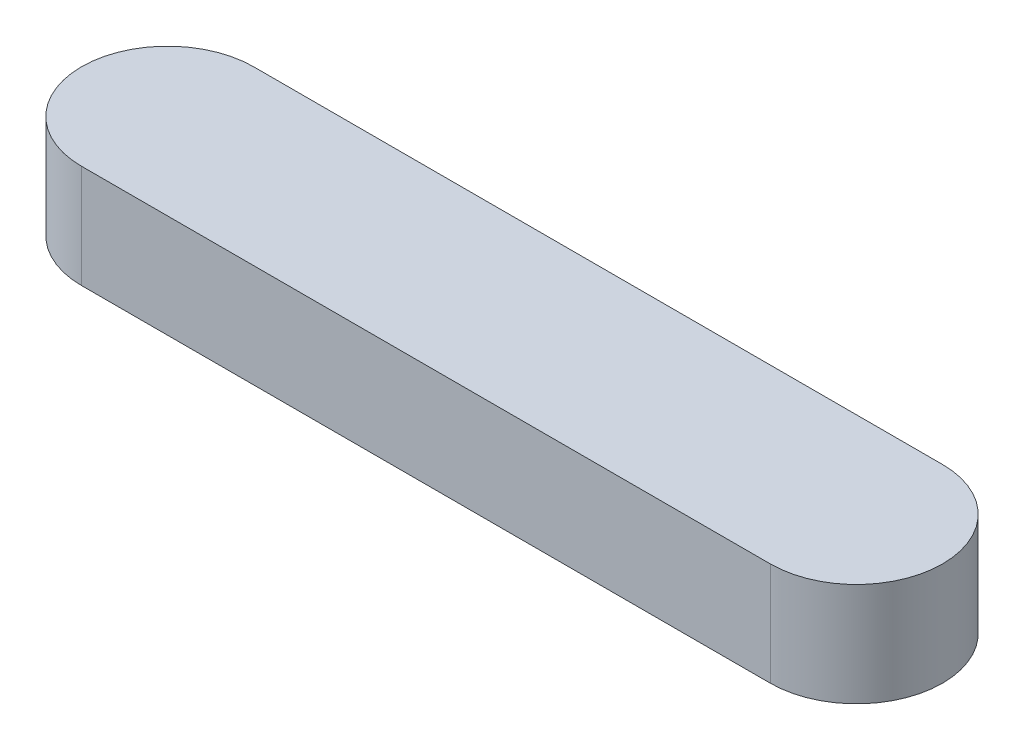
ISO-10303-21;
HEADER;
FILE_DESCRIPTION(('STEP AP214'),'2;1');
FILE_NAME('part.step','',(''),(''),'','','');
FILE_SCHEMA(('AUTOMOTIVE_DESIGN { 1 0 10303 214 1 1 1 1 }'));
ENDSEC;
DATA;
#1=APPLICATION_CONTEXT('core data for automotive mechanical design processes');
#2=APPLICATION_PROTOCOL_DEFINITION('international standard','automotive_design',2000,#1);
#3=PRODUCT_CONTEXT('',#1,'mechanical');
#4=PRODUCT('Part','Part','',(#3));
#5=PRODUCT_RELATED_PRODUCT_CATEGORY('part','',(#4));
#6=PRODUCT_DEFINITION_FORMATION('','',#4);
#7=PRODUCT_DEFINITION_CONTEXT('part definition',#1,'design');
#8=PRODUCT_DEFINITION('design','',#6,#7);
#9=PRODUCT_DEFINITION_SHAPE('','',#8);
#10=(LENGTH_UNIT() NAMED_UNIT(*) SI_UNIT(.MILLI.,.METRE.));
#11=(NAMED_UNIT(*) PLANE_ANGLE_UNIT() SI_UNIT($,.RADIAN.));
#12=(NAMED_UNIT(*) SI_UNIT($,.STERADIAN.) SOLID_ANGLE_UNIT());
#13=UNCERTAINTY_MEASURE_WITH_UNIT(LENGTH_MEASURE(1.E-05),#10,'distance_accuracy_value','');
#14=(GEOMETRIC_REPRESENTATION_CONTEXT(3) GLOBAL_UNCERTAINTY_ASSIGNED_CONTEXT((#13)) GLOBAL_UNIT_ASSIGNED_CONTEXT((#10,
#11,#12)) REPRESENTATION_CONTEXT('',''));
#15=CARTESIAN_POINT('',(0.,0.,0.));
#16=DIRECTION('',(0.,0.,1.));
#17=DIRECTION('',(1.,0.,0.));
#18=AXIS2_PLACEMENT_3D('',#15,#16,#17);
#19=CARTESIAN_POINT('',(40.,12.,0.));
#20=DIRECTION('',(0.,-1.,0.));
#21=DIRECTION('',(0.,0.,-1.));
#22=AXIS2_PLACEMENT_3D('',#19,#20,#21);
#23=CYLINDRICAL_SURFACE('',#22,10.);
#24=CARTESIAN_POINT('',(40.,0.,0.));
#25=DIRECTION('',(0.,1.,0.));
#26=DIRECTION('',(0.,0.,1.));
#27=AXIS2_PLACEMENT_3D('',#24,#25,#26);
#28=CIRCLE('',#27,10.);
#29=CARTESIAN_POINT('',(40.,0.,10.));
#30=VERTEX_POINT('',#29);
#31=CARTESIAN_POINT('',(40.,0.,-9.99999999999999));
#32=VERTEX_POINT('',#31);
#33=EDGE_CURVE('E107',#30,#32,#28,.T.);
#34=ORIENTED_EDGE('',*,*,#33,.T.);
#35=DIRECTION('',(0.,-1.,0.));
#36=VECTOR('',#35,1.);
#37=CARTESIAN_POINT('',(40.,12.,-9.99999999999999));
#38=LINE('',#37,#36);
#39=CARTESIAN_POINT('',(40.,12.,-9.99999999999999));
#40=VERTEX_POINT('',#39);
#41=EDGE_CURVE('E11',#40,#32,#38,.T.);
#42=ORIENTED_EDGE('',*,*,#41,.F.);
#43=CARTESIAN_POINT('',(40.,12.,0.));
#44=DIRECTION('',(0.,1.,0.));
#45=DIRECTION('',(0.,0.,1.));
#46=AXIS2_PLACEMENT_3D('',#43,#44,#45);
#47=CIRCLE('',#46,10.);
#48=CARTESIAN_POINT('',(40.,12.,10.));
#49=VERTEX_POINT('',#48);
#50=EDGE_CURVE('E91',#49,#40,#47,.T.);
#51=ORIENTED_EDGE('',*,*,#50,.F.);
#52=DIRECTION('',(0.,-1.,0.));
#53=VECTOR('',#52,1.);
#54=CARTESIAN_POINT('',(40.,12.,10.));
#55=LINE('',#54,#53);
#56=EDGE_CURVE('E103',#49,#30,#55,.T.);
#57=ORIENTED_EDGE('',*,*,#56,.T.);
#58=EDGE_LOOP('',(#34,#42,#51,#57));
#59=FACE_BOUND('',#58,.T.);
#60=ADVANCED_FACE('F39',(#59),#23,.T.);
#61=CARTESIAN_POINT('',(40.,12.,-9.99999999999999));
#62=DIRECTION('',(0.,0.,1.));
#63=DIRECTION('',(1.,0.,0.));
#64=AXIS2_PLACEMENT_3D('',#61,#62,#63);
#65=PLANE('',#64);
#66=DIRECTION('',(-1.,0.,0.));
#67=VECTOR('',#66,1.);
#68=CARTESIAN_POINT('',(40.,0.,-9.99999999999999));
#69=LINE('',#68,#67);
#70=CARTESIAN_POINT('',(-40.,0.,-9.99999999999999));
#71=VERTEX_POINT('',#70);
#72=EDGE_CURVE('E96',#32,#71,#69,.T.);
#73=ORIENTED_EDGE('',*,*,#72,.T.);
#74=DIRECTION('',(0.,-1.,0.));
#75=VECTOR('',#74,1.);
#76=CARTESIAN_POINT('',(-40.,12.,-9.99999999999999));
#77=LINE('',#76,#75);
#78=CARTESIAN_POINT('',(-40.,12.,-9.99999999999999));
#79=VERTEX_POINT('',#78);
#80=EDGE_CURVE('E48',#79,#71,#77,.T.);
#81=ORIENTED_EDGE('',*,*,#80,.F.);
#82=DIRECTION('',(-1.,0.,0.));
#83=VECTOR('',#82,1.);
#84=CARTESIAN_POINT('',(40.,12.,-9.99999999999999));
#85=LINE('',#84,#83);
#86=EDGE_CURVE('E86',#40,#79,#85,.T.);
#87=ORIENTED_EDGE('',*,*,#86,.F.);
#88=ORIENTED_EDGE('',*,*,#41,.T.);
#89=EDGE_LOOP('',(#73,#81,#87,#88));
#90=FACE_BOUND('',#89,.T.);
#91=ADVANCED_FACE('F95',(#90),#65,.F.);
#92=CARTESIAN_POINT('',(-40.,12.,0.));
#93=DIRECTION('',(0.,-1.,0.));
#94=DIRECTION('',(0.,0.,-1.));
#95=AXIS2_PLACEMENT_3D('',#92,#93,#94);
#96=CYLINDRICAL_SURFACE('',#95,10.);
#97=CARTESIAN_POINT('',(-40.,0.,0.));
#98=DIRECTION('',(0.,1.,0.));
#99=DIRECTION('',(0.,0.,1.));
#100=AXIS2_PLACEMENT_3D('',#97,#98,#99);
#101=CIRCLE('',#100,10.);
#102=CARTESIAN_POINT('',(-40.,0.,10.));
#103=VERTEX_POINT('',#102);
#104=EDGE_CURVE('E73',#71,#103,#101,.T.);
#105=ORIENTED_EDGE('',*,*,#104,.T.);
#106=DIRECTION('',(0.,-1.,0.));
#107=VECTOR('',#106,1.);
#108=CARTESIAN_POINT('',(-40.,12.,10.));
#109=LINE('',#108,#107);
#110=CARTESIAN_POINT('',(-40.,12.,10.));
#111=VERTEX_POINT('',#110);
#112=EDGE_CURVE('E98',#111,#103,#109,.T.);
#113=ORIENTED_EDGE('',*,*,#112,.F.);
#114=CARTESIAN_POINT('',(-40.,12.,0.));
#115=DIRECTION('',(0.,1.,0.));
#116=DIRECTION('',(0.,0.,1.));
#117=AXIS2_PLACEMENT_3D('',#114,#115,#116);
#118=CIRCLE('',#117,10.);
#119=EDGE_CURVE('E89',#79,#111,#118,.T.);
#120=ORIENTED_EDGE('',*,*,#119,.F.);
#121=ORIENTED_EDGE('',*,*,#80,.T.);
#122=EDGE_LOOP('',(#105,#113,#120,#121));
#123=FACE_BOUND('',#122,.T.);
#124=ADVANCED_FACE('F99',(#123),#96,.T.);
#125=CARTESIAN_POINT('',(40.,12.,10.));
#126=DIRECTION('',(0.,0.,-1.));
#127=DIRECTION('',(-1.,0.,0.));
#128=AXIS2_PLACEMENT_3D('',#125,#126,#127);
#129=PLANE('',#128);
#130=DIRECTION('',(1.,0.,0.));
#131=VECTOR('',#130,1.);
#132=CARTESIAN_POINT('',(40.,0.,10.));
#133=LINE('',#132,#131);
#134=EDGE_CURVE('E79',#103,#30,#133,.T.);
#135=ORIENTED_EDGE('',*,*,#134,.T.);
#136=ORIENTED_EDGE('',*,*,#56,.F.);
#137=DIRECTION('',(1.,0.,0.));
#138=VECTOR('',#137,1.);
#139=CARTESIAN_POINT('',(40.,12.,10.));
#140=LINE('',#139,#138);
#141=EDGE_CURVE('E56',#111,#49,#140,.T.);
#142=ORIENTED_EDGE('',*,*,#141,.F.);
#143=ORIENTED_EDGE('',*,*,#112,.T.);
#144=EDGE_LOOP('',(#135,#136,#142,#143));
#145=FACE_BOUND('',#144,.T.);
#146=ADVANCED_FACE('F120',(#145),#129,.F.);
#147=CARTESIAN_POINT('',(40.,12.,0.));
#148=DIRECTION('',(0.,1.,0.));
#149=DIRECTION('',(0.,0.,1.));
#150=AXIS2_PLACEMENT_3D('',#147,#148,#149);
#151=PLANE('',#150);
#152=ORIENTED_EDGE('',*,*,#50,.T.);
#153=ORIENTED_EDGE('',*,*,#86,.T.);
#154=ORIENTED_EDGE('',*,*,#119,.T.);
#155=ORIENTED_EDGE('',*,*,#141,.T.);
#156=EDGE_LOOP('',(#152,#153,#154,#155));
#157=FACE_BOUND('',#156,.T.);
#158=ADVANCED_FACE('F87',(#157),#151,.T.);
#159=CARTESIAN_POINT('',(40.,0.,0.));
#160=DIRECTION('',(0.,1.,0.));
#161=DIRECTION('',(0.,0.,1.));
#162=AXIS2_PLACEMENT_3D('',#159,#160,#161);
#163=PLANE('',#162);
#164=ORIENTED_EDGE('',*,*,#33,.F.);
#165=ORIENTED_EDGE('',*,*,#134,.F.);
#166=ORIENTED_EDGE('',*,*,#104,.F.);
#167=ORIENTED_EDGE('',*,*,#72,.F.);
#168=EDGE_LOOP('',(#164,#165,#166,#167));
#169=FACE_BOUND('',#168,.T.);
#170=ADVANCED_FACE('F123',(#169),#163,.F.);
#171=CLOSED_SHELL('',(#60,#91,#124,#146,#158,#170));
#172=MANIFOLD_SOLID_BREP('B2',#171);
#173=ADVANCED_BREP_SHAPE_REPRESENTATION('',(#18,#172),#14);
#174=SHAPE_DEFINITION_REPRESENTATION(#9,#173);
ENDSEC;
END-ISO-10303-21;
